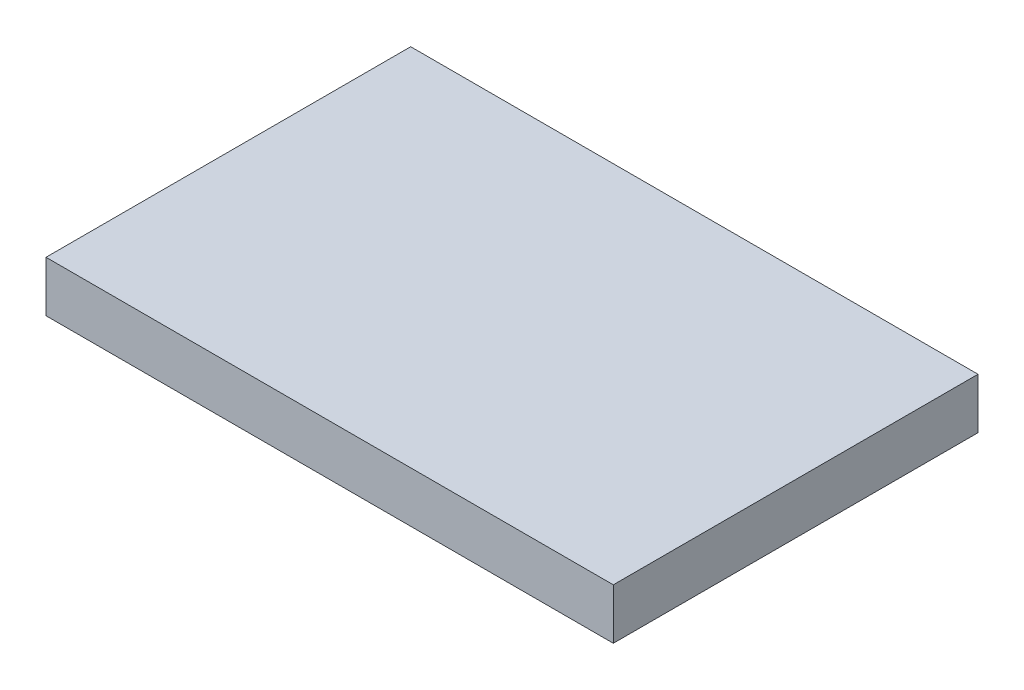
ISO-10303-21;
HEADER;
FILE_DESCRIPTION(('STEP AP214'),'2;1');
FILE_NAME('part.step','',(''),(''),'','','');
FILE_SCHEMA(('AUTOMOTIVE_DESIGN { 1 0 10303 214 1 1 1 1 }'));
ENDSEC;
DATA;
#1=APPLICATION_CONTEXT('core data for automotive mechanical design processes');
#2=APPLICATION_PROTOCOL_DEFINITION('international standard','automotive_design',2000,#1);
#3=PRODUCT_CONTEXT('',#1,'mechanical');
#4=PRODUCT('Part','Part','',(#3));
#5=PRODUCT_RELATED_PRODUCT_CATEGORY('part','',(#4));
#6=PRODUCT_DEFINITION_FORMATION('','',#4);
#7=PRODUCT_DEFINITION_CONTEXT('part definition',#1,'design');
#8=PRODUCT_DEFINITION('design','',#6,#7);
#9=PRODUCT_DEFINITION_SHAPE('','',#8);
#10=(LENGTH_UNIT() NAMED_UNIT(*) SI_UNIT(.MILLI.,.METRE.));
#11=(NAMED_UNIT(*) PLANE_ANGLE_UNIT() SI_UNIT($,.RADIAN.));
#12=(NAMED_UNIT(*) SI_UNIT($,.STERADIAN.) SOLID_ANGLE_UNIT());
#13=UNCERTAINTY_MEASURE_WITH_UNIT(LENGTH_MEASURE(1.E-05),#10,'distance_accuracy_value','');
#14=(GEOMETRIC_REPRESENTATION_CONTEXT(3) GLOBAL_UNCERTAINTY_ASSIGNED_CONTEXT((#13)) GLOBAL_UNIT_ASSIGNED_CONTEXT((#10,
#11,#12)) REPRESENTATION_CONTEXT('',''));
#15=CARTESIAN_POINT('',(0.,0.,0.));
#16=DIRECTION('',(0.,0.,1.));
#17=DIRECTION('',(1.,0.,0.));
#18=AXIS2_PLACEMENT_3D('',#15,#16,#17);
#19=CARTESIAN_POINT('',(0.,2.5,0.));
#20=DIRECTION('',(1.,0.,0.));
#21=DIRECTION('',(0.,0.,-1.));
#22=AXIS2_PLACEMENT_3D('',#19,#20,#21);
#23=PLANE('',#22);
#24=DIRECTION('',(0.,0.,1.));
#25=VECTOR('',#24,1.);
#26=CARTESIAN_POINT('',(0.,0.,0.));
#27=LINE('',#26,#25);
#28=CARTESIAN_POINT('',(0.,0.,-18.));
#29=VERTEX_POINT('',#28);
#30=CARTESIAN_POINT('',(0.,0.,0.));
#31=VERTEX_POINT('',#30);
#32=EDGE_CURVE('E103',#29,#31,#27,.T.);
#33=ORIENTED_EDGE('',*,*,#32,.T.);
#34=DIRECTION('',(0.,-1.,0.));
#35=VECTOR('',#34,1.);
#36=CARTESIAN_POINT('',(0.,2.5,0.));
#37=LINE('',#36,#35);
#38=CARTESIAN_POINT('',(0.,2.5,0.));
#39=VERTEX_POINT('',#38);
#40=EDGE_CURVE('E11',#39,#31,#37,.T.);
#41=ORIENTED_EDGE('',*,*,#40,.F.);
#42=DIRECTION('',(0.,0.,1.));
#43=VECTOR('',#42,1.);
#44=CARTESIAN_POINT('',(0.,2.5,0.));
#45=LINE('',#44,#43);
#46=CARTESIAN_POINT('',(0.,2.5,-18.));
#47=VERTEX_POINT('',#46);
#48=EDGE_CURVE('E91',#47,#39,#45,.T.);
#49=ORIENTED_EDGE('',*,*,#48,.F.);
#50=DIRECTION('',(0.,-1.,0.));
#51=VECTOR('',#50,1.);
#52=CARTESIAN_POINT('',(0.,2.5,-18.));
#53=LINE('',#52,#51);
#54=EDGE_CURVE('E99',#47,#29,#53,.T.);
#55=ORIENTED_EDGE('',*,*,#54,.T.);
#56=EDGE_LOOP('',(#33,#41,#49,#55));
#57=FACE_BOUND('',#56,.T.);
#58=ADVANCED_FACE('F40',(#57),#23,.F.);
#59=CARTESIAN_POINT('',(0.,2.5,0.));
#60=DIRECTION('',(0.,0.,-1.));
#61=DIRECTION('',(-1.,0.,0.));
#62=AXIS2_PLACEMENT_3D('',#59,#60,#61);
#63=PLANE('',#62);
#64=DIRECTION('',(1.,0.,0.));
#65=VECTOR('',#64,1.);
#66=CARTESIAN_POINT('',(0.,0.,0.));
#67=LINE('',#66,#65);
#68=CARTESIAN_POINT('',(28.,0.,0.));
#69=VERTEX_POINT('',#68);
#70=EDGE_CURVE('E95',#31,#69,#67,.T.);
#71=ORIENTED_EDGE('',*,*,#70,.T.);
#72=DIRECTION('',(0.,-1.,0.));
#73=VECTOR('',#72,1.);
#74=CARTESIAN_POINT('',(28.,2.5,0.));
#75=LINE('',#74,#73);
#76=CARTESIAN_POINT('',(28.,2.5,0.));
#77=VERTEX_POINT('',#76);
#78=EDGE_CURVE('E48',#77,#69,#75,.T.);
#79=ORIENTED_EDGE('',*,*,#78,.F.);
#80=DIRECTION('',(1.,0.,0.));
#81=VECTOR('',#80,1.);
#82=CARTESIAN_POINT('',(0.,2.5,0.));
#83=LINE('',#82,#81);
#84=EDGE_CURVE('E86',#39,#77,#83,.T.);
#85=ORIENTED_EDGE('',*,*,#84,.F.);
#86=ORIENTED_EDGE('',*,*,#40,.T.);
#87=EDGE_LOOP('',(#71,#79,#85,#86));
#88=FACE_BOUND('',#87,.T.);
#89=ADVANCED_FACE('F94',(#88),#63,.F.);
#90=CARTESIAN_POINT('',(28.,2.5,0.));
#91=DIRECTION('',(-1.,0.,0.));
#92=DIRECTION('',(0.,0.,1.));
#93=AXIS2_PLACEMENT_3D('',#90,#91,#92);
#94=PLANE('',#93);
#95=DIRECTION('',(0.,0.,-1.));
#96=VECTOR('',#95,1.);
#97=CARTESIAN_POINT('',(28.,0.,0.));
#98=LINE('',#97,#96);
#99=CARTESIAN_POINT('',(28.,0.,-18.));
#100=VERTEX_POINT('',#99);
#101=EDGE_CURVE('E73',#69,#100,#98,.T.);
#102=ORIENTED_EDGE('',*,*,#101,.T.);
#103=DIRECTION('',(0.,-1.,0.));
#104=VECTOR('',#103,1.);
#105=CARTESIAN_POINT('',(28.,2.5,-18.));
#106=LINE('',#105,#104);
#107=CARTESIAN_POINT('',(28.,2.5,-18.));
#108=VERTEX_POINT('',#107);
#109=EDGE_CURVE('E96',#108,#100,#106,.T.);
#110=ORIENTED_EDGE('',*,*,#109,.F.);
#111=DIRECTION('',(0.,0.,-1.));
#112=VECTOR('',#111,1.);
#113=CARTESIAN_POINT('',(28.,2.5,0.));
#114=LINE('',#113,#112);
#115=EDGE_CURVE('E89',#77,#108,#114,.T.);
#116=ORIENTED_EDGE('',*,*,#115,.F.);
#117=ORIENTED_EDGE('',*,*,#78,.T.);
#118=EDGE_LOOP('',(#102,#110,#116,#117));
#119=FACE_BOUND('',#118,.T.);
#120=ADVANCED_FACE('F97',(#119),#94,.F.);
#121=CARTESIAN_POINT('',(0.,2.5,-18.));
#122=DIRECTION('',(0.,0.,1.));
#123=DIRECTION('',(1.,0.,0.));
#124=AXIS2_PLACEMENT_3D('',#121,#122,#123);
#125=PLANE('',#124);
#126=DIRECTION('',(-1.,0.,0.));
#127=VECTOR('',#126,1.);
#128=CARTESIAN_POINT('',(0.,0.,-18.));
#129=LINE('',#128,#127);
#130=EDGE_CURVE('E79',#100,#29,#129,.T.);
#131=ORIENTED_EDGE('',*,*,#130,.T.);
#132=ORIENTED_EDGE('',*,*,#54,.F.);
#133=DIRECTION('',(-1.,0.,0.));
#134=VECTOR('',#133,1.);
#135=CARTESIAN_POINT('',(0.,2.5,-18.));
#136=LINE('',#135,#134);
#137=EDGE_CURVE('E56',#108,#47,#136,.T.);
#138=ORIENTED_EDGE('',*,*,#137,.F.);
#139=ORIENTED_EDGE('',*,*,#109,.T.);
#140=EDGE_LOOP('',(#131,#132,#138,#139));
#141=FACE_BOUND('',#140,.T.);
#142=ADVANCED_FACE('F110',(#141),#125,.F.);
#143=CARTESIAN_POINT('',(0.,2.5,0.));
#144=DIRECTION('',(0.,-1.,0.));
#145=DIRECTION('',(0.,0.,-1.));
#146=AXIS2_PLACEMENT_3D('',#143,#144,#145);
#147=PLANE('',#146);
#148=ORIENTED_EDGE('',*,*,#48,.T.);
#149=ORIENTED_EDGE('',*,*,#84,.T.);
#150=ORIENTED_EDGE('',*,*,#115,.T.);
#151=ORIENTED_EDGE('',*,*,#137,.T.);
#152=EDGE_LOOP('',(#148,#149,#150,#151));
#153=FACE_BOUND('',#152,.T.);
#154=ADVANCED_FACE('F87',(#153),#147,.F.);
#155=CARTESIAN_POINT('',(0.,0.,0.));
#156=DIRECTION('',(0.,-1.,0.));
#157=DIRECTION('',(0.,0.,-1.));
#158=AXIS2_PLACEMENT_3D('',#155,#156,#157);
#159=PLANE('',#158);
#160=ORIENTED_EDGE('',*,*,#32,.F.);
#161=ORIENTED_EDGE('',*,*,#130,.F.);
#162=ORIENTED_EDGE('',*,*,#101,.F.);
#163=ORIENTED_EDGE('',*,*,#70,.F.);
#164=EDGE_LOOP('',(#160,#161,#162,#163));
#165=FACE_BOUND('',#164,.T.);
#166=ADVANCED_FACE('F113',(#165),#159,.T.);
#167=CLOSED_SHELL('',(#58,#89,#120,#142,#154,#166));
#168=MANIFOLD_SOLID_BREP('B2',#167);
#169=ADVANCED_BREP_SHAPE_REPRESENTATION('',(#18,#168),#14);
#170=SHAPE_DEFINITION_REPRESENTATION(#9,#169);
ENDSEC;
END-ISO-10303-21;
